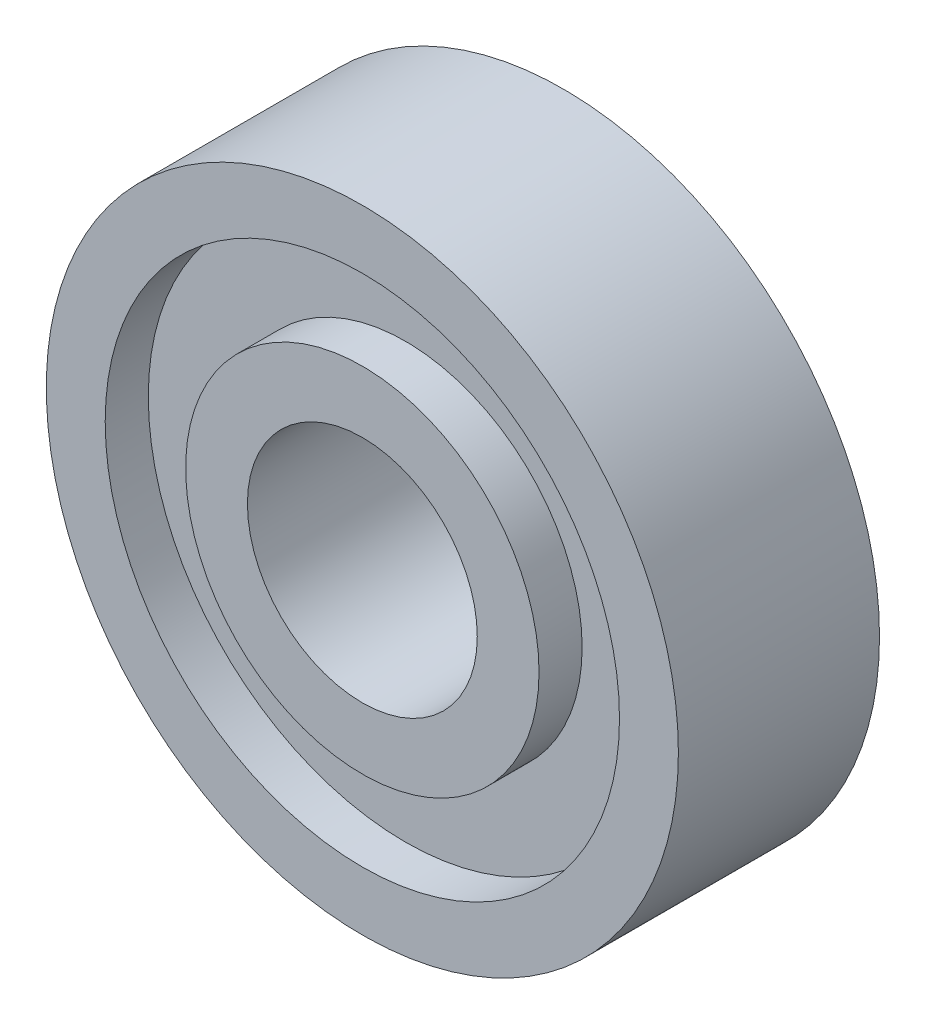
ISO-10303-21;
HEADER;
FILE_DESCRIPTION(('STEP AP214'),'2;1');
FILE_NAME('part.step','',(''),(''),'','','');
FILE_SCHEMA(('AUTOMOTIVE_DESIGN { 1 0 10303 214 1 1 1 1 }'));
ENDSEC;
DATA;
#1=APPLICATION_CONTEXT('core data for automotive mechanical design processes');
#2=APPLICATION_PROTOCOL_DEFINITION('international standard','automotive_design',2000,#1);
#3=PRODUCT_CONTEXT('',#1,'mechanical');
#4=PRODUCT('Part','Part','',(#3));
#5=PRODUCT_RELATED_PRODUCT_CATEGORY('part','',(#4));
#6=PRODUCT_DEFINITION_FORMATION('','',#4);
#7=PRODUCT_DEFINITION_CONTEXT('part definition',#1,'design');
#8=PRODUCT_DEFINITION('design','',#6,#7);
#9=PRODUCT_DEFINITION_SHAPE('','',#8);
#10=(LENGTH_UNIT() NAMED_UNIT(*) SI_UNIT(.MILLI.,.METRE.));
#11=(NAMED_UNIT(*) PLANE_ANGLE_UNIT() SI_UNIT($,.RADIAN.));
#12=(NAMED_UNIT(*) SI_UNIT($,.STERADIAN.) SOLID_ANGLE_UNIT());
#13=UNCERTAINTY_MEASURE_WITH_UNIT(LENGTH_MEASURE(1.E-05),#10,'distance_accuracy_value','');
#14=(GEOMETRIC_REPRESENTATION_CONTEXT(3) GLOBAL_UNCERTAINTY_ASSIGNED_CONTEXT((#13)) GLOBAL_UNIT_ASSIGNED_CONTEXT((#10,
#11,#12)) REPRESENTATION_CONTEXT('',''));
#15=CARTESIAN_POINT('',(0.,0.,0.));
#16=DIRECTION('',(0.,0.,1.));
#17=DIRECTION('',(1.,0.,0.));
#18=AXIS2_PLACEMENT_3D('',#15,#16,#17);
#19=CARTESIAN_POINT('',(0.,0.,-3.5));
#20=DIRECTION('',(0.,0.,1.));
#21=DIRECTION('',(1.,0.,0.));
#22=AXIS2_PLACEMENT_3D('',#19,#20,#21);
#23=CYLINDRICAL_SURFACE('',#22,8.95);
#24=CARTESIAN_POINT('',(0.,0.,-3.5));
#25=DIRECTION('',(0.,0.,1.));
#26=DIRECTION('',(1.,0.,0.));
#27=AXIS2_PLACEMENT_3D('',#24,#25,#26);
#28=CIRCLE('',#27,8.95);
#29=CARTESIAN_POINT('',(8.95,0.,-3.5));
#30=VERTEX_POINT('',#29);
#31=EDGE_CURVE('E57',#30,#30,#28,.T.);
#32=ORIENTED_EDGE('',*,*,#31,.F.);
#33=EDGE_LOOP('',(#32));
#34=FACE_BOUND('',#33,.T.);
#35=CARTESIAN_POINT('',(0.,0.,-2.));
#36=DIRECTION('',(0.,0.,1.));
#37=DIRECTION('',(1.,0.,0.));
#38=AXIS2_PLACEMENT_3D('',#35,#36,#37);
#39=CIRCLE('',#38,8.95);
#40=CARTESIAN_POINT('',(8.95,0.,-2.));
#41=VERTEX_POINT('',#40);
#42=EDGE_CURVE('E11',#41,#41,#39,.F.);
#43=ORIENTED_EDGE('',*,*,#42,.F.);
#44=EDGE_LOOP('',(#43));
#45=FACE_BOUND('',#44,.T.);
#46=ADVANCED_FACE('F46',(#34,#45),#23,.F.);
#47=CARTESIAN_POINT('',(0.,0.,2.));
#48=DIRECTION('',(0.,0.,1.));
#49=DIRECTION('',(1.,0.,0.));
#50=AXIS2_PLACEMENT_3D('',#47,#48,#49);
#51=CIRCLE('',#50,8.95);
#52=CARTESIAN_POINT('',(8.95,0.,2.));
#53=VERTEX_POINT('',#52);
#54=EDGE_CURVE('E69',#53,#53,#51,.T.);
#55=ORIENTED_EDGE('',*,*,#54,.F.);
#56=EDGE_LOOP('',(#55));
#57=FACE_BOUND('',#56,.T.);
#58=CARTESIAN_POINT('',(0.,0.,3.5));
#59=DIRECTION('',(0.,0.,1.));
#60=DIRECTION('',(1.,0.,0.));
#61=AXIS2_PLACEMENT_3D('',#58,#59,#60);
#62=CIRCLE('',#61,8.95);
#63=CARTESIAN_POINT('',(8.95,0.,3.5));
#64=VERTEX_POINT('',#63);
#65=EDGE_CURVE('E66',#64,#64,#62,.T.);
#66=ORIENTED_EDGE('',*,*,#65,.T.);
#67=EDGE_LOOP('',(#66));
#68=FACE_BOUND('',#67,.T.);
#69=ADVANCED_FACE('F48',(#57,#68),#23,.F.);
#70=CARTESIAN_POINT('',(0.,0.,-3.5));
#71=DIRECTION('',(0.,0.,1.));
#72=DIRECTION('',(1.,0.,0.));
#73=AXIS2_PLACEMENT_3D('',#70,#71,#72);
#74=CYLINDRICAL_SURFACE('',#73,11.);
#75=CARTESIAN_POINT('',(0.,0.,-3.5));
#76=DIRECTION('',(0.,0.,1.));
#77=DIRECTION('',(1.,0.,0.));
#78=AXIS2_PLACEMENT_3D('',#75,#76,#77);
#79=CIRCLE('',#78,11.);
#80=CARTESIAN_POINT('',(11.,0.,-3.5));
#81=VERTEX_POINT('',#80);
#82=EDGE_CURVE('E53',#81,#81,#79,.T.);
#83=ORIENTED_EDGE('',*,*,#82,.T.);
#84=EDGE_LOOP('',(#83));
#85=FACE_BOUND('',#84,.T.);
#86=CARTESIAN_POINT('',(0.,0.,3.5));
#87=DIRECTION('',(0.,0.,1.));
#88=DIRECTION('',(1.,0.,0.));
#89=AXIS2_PLACEMENT_3D('',#86,#87,#88);
#90=CIRCLE('',#89,11.);
#91=CARTESIAN_POINT('',(11.,0.,3.5));
#92=VERTEX_POINT('',#91);
#93=EDGE_CURVE('E61',#92,#92,#90,.T.);
#94=ORIENTED_EDGE('',*,*,#93,.F.);
#95=EDGE_LOOP('',(#94));
#96=FACE_BOUND('',#95,.T.);
#97=ADVANCED_FACE('F121',(#85,#96),#74,.T.);
#98=CARTESIAN_POINT('',(0.,0.,-3.5));
#99=DIRECTION('',(0.,0.,1.));
#100=DIRECTION('',(1.,0.,0.));
#101=AXIS2_PLACEMENT_3D('',#98,#99,#100);
#102=PLANE('',#101);
#103=ORIENTED_EDGE('',*,*,#31,.T.);
#104=EDGE_LOOP('',(#103));
#105=FACE_BOUND('',#104,.T.);
#106=ORIENTED_EDGE('',*,*,#82,.F.);
#107=EDGE_LOOP('',(#106));
#108=FACE_BOUND('',#107,.T.);
#109=ADVANCED_FACE('F126',(#105,#108),#102,.F.);
#110=CARTESIAN_POINT('',(0.,0.,3.5));
#111=DIRECTION('',(0.,0.,1.));
#112=DIRECTION('',(1.,0.,0.));
#113=AXIS2_PLACEMENT_3D('',#110,#111,#112);
#114=PLANE('',#113);
#115=ORIENTED_EDGE('',*,*,#65,.F.);
#116=EDGE_LOOP('',(#115));
#117=FACE_BOUND('',#116,.T.);
#118=ORIENTED_EDGE('',*,*,#93,.T.);
#119=EDGE_LOOP('',(#118));
#120=FACE_BOUND('',#119,.T.);
#121=ADVANCED_FACE('F129',(#117,#120),#114,.T.);
#122=CARTESIAN_POINT('',(0.,0.,-2.));
#123=DIRECTION('',(0.,0.,1.));
#124=DIRECTION('',(1.,0.,0.));
#125=AXIS2_PLACEMENT_3D('',#122,#123,#124);
#126=PLANE('',#125);
#127=CARTESIAN_POINT('',(0.,0.,-2.));
#128=DIRECTION('',(0.,0.,1.));
#129=DIRECTION('',(1.,0.,0.));
#130=AXIS2_PLACEMENT_3D('',#127,#128,#129);
#131=CIRCLE('',#130,6.15);
#132=CARTESIAN_POINT('',(6.15,0.,-2.));
#133=VERTEX_POINT('',#132);
#134=EDGE_CURVE('E75',#133,#133,#131,.T.);
#135=ORIENTED_EDGE('',*,*,#134,.T.);
#136=EDGE_LOOP('',(#135));
#137=FACE_BOUND('',#136,.T.);
#138=ORIENTED_EDGE('',*,*,#42,.T.);
#139=EDGE_LOOP('',(#138));
#140=FACE_BOUND('',#139,.T.);
#141=ADVANCED_FACE('F135',(#137,#140),#126,.F.);
#142=CARTESIAN_POINT('',(0.,0.,2.));
#143=DIRECTION('',(0.,0.,1.));
#144=DIRECTION('',(1.,0.,0.));
#145=AXIS2_PLACEMENT_3D('',#142,#143,#144);
#146=PLANE('',#145);
#147=CARTESIAN_POINT('',(0.,0.,2.));
#148=DIRECTION('',(0.,0.,1.));
#149=DIRECTION('',(1.,0.,0.));
#150=AXIS2_PLACEMENT_3D('',#147,#148,#149);
#151=CIRCLE('',#150,6.15);
#152=CARTESIAN_POINT('',(6.15,0.,2.));
#153=VERTEX_POINT('',#152);
#154=EDGE_CURVE('E72',#153,#153,#151,.T.);
#155=ORIENTED_EDGE('',*,*,#154,.F.);
#156=EDGE_LOOP('',(#155));
#157=FACE_BOUND('',#156,.T.);
#158=ORIENTED_EDGE('',*,*,#54,.T.);
#159=EDGE_LOOP('',(#158));
#160=FACE_BOUND('',#159,.T.);
#161=ADVANCED_FACE('F114',(#157,#160),#146,.T.);
#162=CARTESIAN_POINT('',(0.,0.,-3.5));
#163=DIRECTION('',(0.,0.,1.));
#164=DIRECTION('',(1.,0.,0.));
#165=AXIS2_PLACEMENT_3D('',#162,#163,#164);
#166=CYLINDRICAL_SURFACE('',#165,6.15);
#167=CARTESIAN_POINT('',(0.,0.,-3.5));
#168=DIRECTION('',(0.,0.,1.));
#169=DIRECTION('',(1.,0.,0.));
#170=AXIS2_PLACEMENT_3D('',#167,#168,#169);
#171=CIRCLE('',#170,6.15);
#172=CARTESIAN_POINT('',(6.15,0.,-3.5));
#173=VERTEX_POINT('',#172);
#174=EDGE_CURVE('E78',#173,#173,#171,.T.);
#175=ORIENTED_EDGE('',*,*,#174,.T.);
#176=EDGE_LOOP('',(#175));
#177=FACE_BOUND('',#176,.T.);
#178=ORIENTED_EDGE('',*,*,#134,.F.);
#179=EDGE_LOOP('',(#178));
#180=FACE_BOUND('',#179,.T.);
#181=ADVANCED_FACE('F104',(#177,#180),#166,.T.);
#182=CARTESIAN_POINT('',(0.,0.,-3.5));
#183=DIRECTION('',(0.,0.,1.));
#184=DIRECTION('',(1.,0.,0.));
#185=AXIS2_PLACEMENT_3D('',#182,#183,#184);
#186=CYLINDRICAL_SURFACE('',#185,4.);
#187=CARTESIAN_POINT('',(0.,0.,-3.5));
#188=DIRECTION('',(0.,0.,1.));
#189=DIRECTION('',(1.,0.,0.));
#190=AXIS2_PLACEMENT_3D('',#187,#188,#189);
#191=CIRCLE('',#190,4.);
#192=CARTESIAN_POINT('',(4.,0.,-3.5));
#193=VERTEX_POINT('',#192);
#194=EDGE_CURVE('E81',#193,#193,#191,.T.);
#195=ORIENTED_EDGE('',*,*,#194,.F.);
#196=EDGE_LOOP('',(#195));
#197=FACE_BOUND('',#196,.T.);
#198=CARTESIAN_POINT('',(0.,0.,3.5));
#199=DIRECTION('',(0.,0.,1.));
#200=DIRECTION('',(1.,0.,0.));
#201=AXIS2_PLACEMENT_3D('',#198,#199,#200);
#202=CIRCLE('',#201,4.);
#203=CARTESIAN_POINT('',(4.,0.,3.5));
#204=VERTEX_POINT('',#203);
#205=EDGE_CURVE('E87',#204,#204,#202,.T.);
#206=ORIENTED_EDGE('',*,*,#205,.T.);
#207=EDGE_LOOP('',(#206));
#208=FACE_BOUND('',#207,.T.);
#209=ADVANCED_FACE('F91',(#197,#208),#186,.F.);
#210=ORIENTED_EDGE('',*,*,#154,.T.);
#211=EDGE_LOOP('',(#210));
#212=FACE_BOUND('',#211,.T.);
#213=CARTESIAN_POINT('',(0.,0.,3.5));
#214=DIRECTION('',(0.,0.,1.));
#215=DIRECTION('',(1.,0.,0.));
#216=AXIS2_PLACEMENT_3D('',#213,#214,#215);
#217=CIRCLE('',#216,6.15);
#218=CARTESIAN_POINT('',(6.15,0.,3.5));
#219=VERTEX_POINT('',#218);
#220=EDGE_CURVE('E84',#219,#219,#217,.T.);
#221=ORIENTED_EDGE('',*,*,#220,.F.);
#222=EDGE_LOOP('',(#221));
#223=FACE_BOUND('',#222,.T.);
#224=ADVANCED_FACE('F100',(#212,#223),#166,.T.);
#225=CARTESIAN_POINT('',(0.,0.,-3.5));
#226=DIRECTION('',(0.,0.,1.));
#227=DIRECTION('',(1.,0.,0.));
#228=AXIS2_PLACEMENT_3D('',#225,#226,#227);
#229=PLANE('',#228);
#230=ORIENTED_EDGE('',*,*,#194,.T.);
#231=EDGE_LOOP('',(#230));
#232=FACE_BOUND('',#231,.T.);
#233=ORIENTED_EDGE('',*,*,#174,.F.);
#234=EDGE_LOOP('',(#233));
#235=FACE_BOUND('',#234,.T.);
#236=ADVANCED_FACE('F96',(#232,#235),#229,.F.);
#237=CARTESIAN_POINT('',(0.,0.,3.5));
#238=DIRECTION('',(0.,0.,1.));
#239=DIRECTION('',(1.,0.,0.));
#240=AXIS2_PLACEMENT_3D('',#237,#238,#239);
#241=PLANE('',#240);
#242=ORIENTED_EDGE('',*,*,#205,.F.);
#243=EDGE_LOOP('',(#242));
#244=FACE_BOUND('',#243,.T.);
#245=ORIENTED_EDGE('',*,*,#220,.T.);
#246=EDGE_LOOP('',(#245));
#247=FACE_BOUND('',#246,.T.);
#248=ADVANCED_FACE('F93',(#244,#247),#241,.T.);
#249=CLOSED_SHELL('',(#46,#69,#97,#109,#121,#141,#161,#181,#209,#224,#236,#248));
#250=MANIFOLD_SOLID_BREP('B2',#249);
#251=ADVANCED_BREP_SHAPE_REPRESENTATION('',(#18,#250),#14);
#252=SHAPE_DEFINITION_REPRESENTATION(#9,#251);
ENDSEC;
END-ISO-10303-21;
